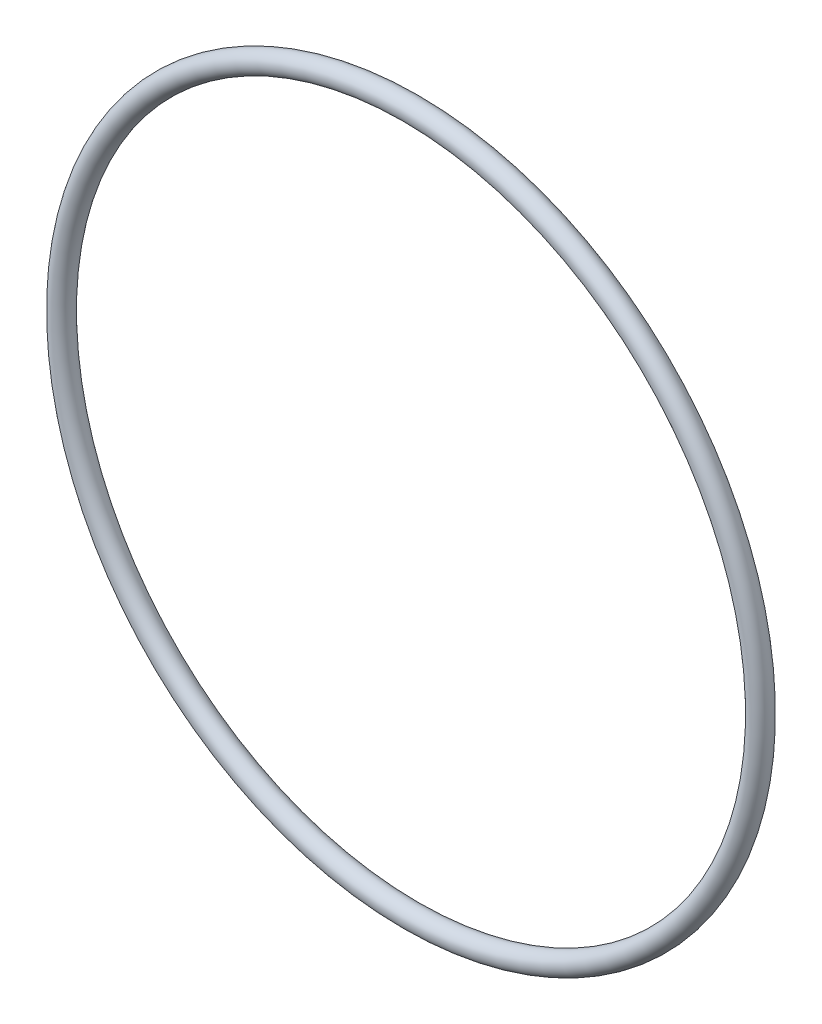
ISO-10303-21;
HEADER;
FILE_DESCRIPTION(('STEP AP214'),'2;1');
FILE_NAME('part.step','',(''),(''),'','','');
FILE_SCHEMA(('AUTOMOTIVE_DESIGN { 1 0 10303 214 1 1 1 1 }'));
ENDSEC;
DATA;
#1=APPLICATION_CONTEXT('core data for automotive mechanical design processes');
#2=APPLICATION_PROTOCOL_DEFINITION('international standard','automotive_design',2000,#1);
#3=PRODUCT_CONTEXT('',#1,'mechanical');
#4=PRODUCT('Part','Part','',(#3));
#5=PRODUCT_RELATED_PRODUCT_CATEGORY('part','',(#4));
#6=PRODUCT_DEFINITION_FORMATION('','',#4);
#7=PRODUCT_DEFINITION_CONTEXT('part definition',#1,'design');
#8=PRODUCT_DEFINITION('design','',#6,#7);
#9=PRODUCT_DEFINITION_SHAPE('','',#8);
#10=(LENGTH_UNIT() NAMED_UNIT(*) SI_UNIT(.MILLI.,.METRE.));
#11=(NAMED_UNIT(*) PLANE_ANGLE_UNIT() SI_UNIT($,.RADIAN.));
#12=(NAMED_UNIT(*) SI_UNIT($,.STERADIAN.) SOLID_ANGLE_UNIT());
#13=UNCERTAINTY_MEASURE_WITH_UNIT(LENGTH_MEASURE(1.E-05),#10,'distance_accuracy_value','');
#14=(GEOMETRIC_REPRESENTATION_CONTEXT(3) GLOBAL_UNCERTAINTY_ASSIGNED_CONTEXT((#13)) GLOBAL_UNIT_ASSIGNED_CONTEXT((#10,
#11,#12)) REPRESENTATION_CONTEXT('',''));
#15=CARTESIAN_POINT('',(0.,0.,0.));
#16=DIRECTION('',(0.,0.,1.));
#17=DIRECTION('',(1.,0.,0.));
#18=AXIS2_PLACEMENT_3D('',#15,#16,#17);
#19=CARTESIAN_POINT('',(0.,0.,-4.7));
#20=DIRECTION('',(0.,0.,1.));
#21=DIRECTION('',(0.,-1.,0.));
#22=AXIS2_PLACEMENT_3D('',#19,#20,#21);
#23=TOROIDAL_SURFACE('',#22,13.2,0.4);
#24=CARTESIAN_POINT('',(0.,-13.6,-4.7));
#25=VERTEX_POINT('',#24);
#26=VERTEX_LOOP('',#25);
#27=FACE_BOUND('',#26,.T.);
#28=ADVANCED_FACE('F12',(#27),#23,.T.);
#29=CLOSED_SHELL('',(#28));
#30=MANIFOLD_SOLID_BREP('B1',#29);
#31=ADVANCED_BREP_SHAPE_REPRESENTATION('',(#18,#30),#14);
#32=SHAPE_DEFINITION_REPRESENTATION(#9,#31);
ENDSEC;
END-ISO-10303-21;
